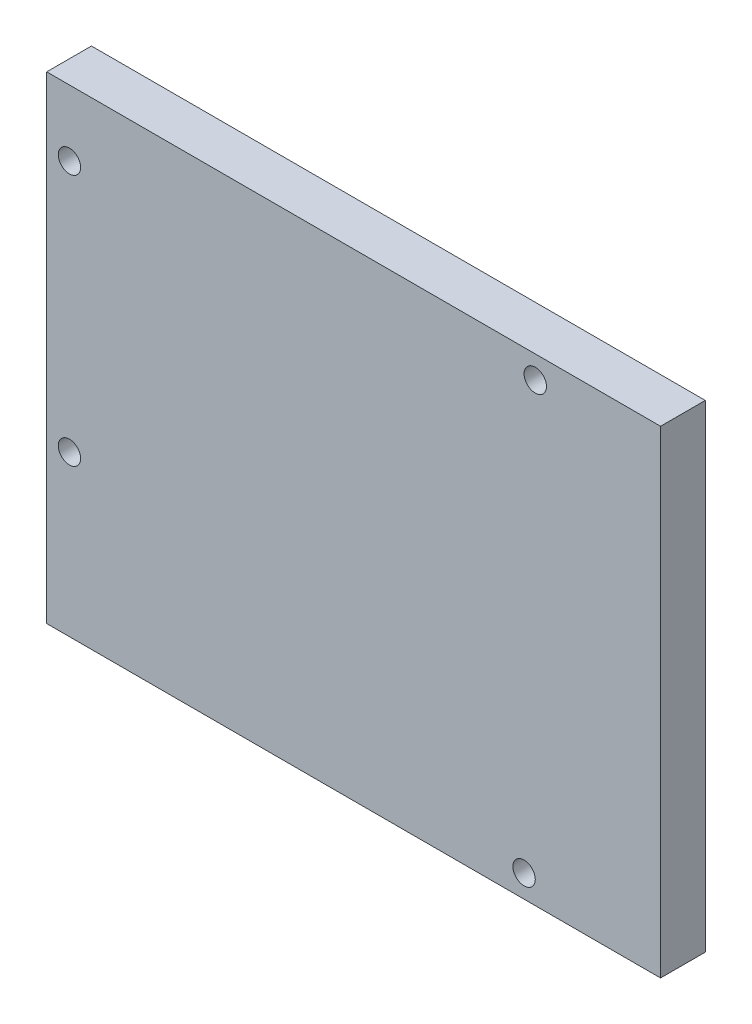
ISO-10303-21;
HEADER;
FILE_DESCRIPTION(('STEP AP214'),'2;1');
FILE_NAME('part.step','',(''),(''),'','','');
FILE_SCHEMA(('AUTOMOTIVE_DESIGN { 1 0 10303 214 1 1 1 1 }'));
ENDSEC;
DATA;
#1=APPLICATION_CONTEXT('core data for automotive mechanical design processes');
#2=APPLICATION_PROTOCOL_DEFINITION('international standard','automotive_design',2000,#1);
#3=PRODUCT_CONTEXT('',#1,'mechanical');
#4=PRODUCT('Part','Part','',(#3));
#5=PRODUCT_RELATED_PRODUCT_CATEGORY('part','',(#4));
#6=PRODUCT_DEFINITION_FORMATION('','',#4);
#7=PRODUCT_DEFINITION_CONTEXT('part definition',#1,'design');
#8=PRODUCT_DEFINITION('design','',#6,#7);
#9=PRODUCT_DEFINITION_SHAPE('','',#8);
#10=(LENGTH_UNIT() NAMED_UNIT(*) SI_UNIT(.MILLI.,.METRE.));
#11=(NAMED_UNIT(*) PLANE_ANGLE_UNIT() SI_UNIT($,.RADIAN.));
#12=(NAMED_UNIT(*) SI_UNIT($,.STERADIAN.) SOLID_ANGLE_UNIT());
#13=UNCERTAINTY_MEASURE_WITH_UNIT(LENGTH_MEASURE(1.E-05),#10,'distance_accuracy_value','');
#14=(GEOMETRIC_REPRESENTATION_CONTEXT(3) GLOBAL_UNCERTAINTY_ASSIGNED_CONTEXT((#13)) GLOBAL_UNIT_ASSIGNED_CONTEXT((#10,
#11,#12)) REPRESENTATION_CONTEXT('',''));
#15=CARTESIAN_POINT('',(0.,0.,0.));
#16=DIRECTION('',(0.,0.,1.));
#17=DIRECTION('',(1.,0.,0.));
#18=AXIS2_PLACEMENT_3D('',#15,#16,#17);
#19=CARTESIAN_POINT('',(0.,37.8100000011118,5.));
#20=DIRECTION('',(1.,0.,0.));
#21=DIRECTION('',(0.,1.,0.));
#22=AXIS2_PLACEMENT_3D('',#19,#20,#21);
#23=PLANE('',#22);
#24=DIRECTION('',(0.,-1.,0.));
#25=VECTOR('',#24,1.);
#26=CARTESIAN_POINT('',(0.,37.8100000011118,0.));
#27=LINE('',#26,#25);
#28=CARTESIAN_POINT('',(0.,37.8100000011118,0.));
#29=VERTEX_POINT('',#28);
#30=CARTESIAN_POINT('',(0.,-15.5899999988882,0.));
#31=VERTEX_POINT('',#30);
#32=EDGE_CURVE('E110',#29,#31,#27,.T.);
#33=ORIENTED_EDGE('',*,*,#32,.T.);
#34=DIRECTION('',(0.,0.,-1.));
#35=VECTOR('',#34,1.);
#36=CARTESIAN_POINT('',(0.,-15.5899999988882,5.));
#37=LINE('',#36,#35);
#38=CARTESIAN_POINT('',(0.,-15.5899999988882,5.));
#39=VERTEX_POINT('',#38);
#40=EDGE_CURVE('E11',#39,#31,#37,.T.);
#41=ORIENTED_EDGE('',*,*,#40,.F.);
#42=DIRECTION('',(0.,-1.,0.));
#43=VECTOR('',#42,1.);
#44=CARTESIAN_POINT('',(0.,37.8100000011118,5.));
#45=LINE('',#44,#43);
#46=CARTESIAN_POINT('',(0.,37.8100000011118,5.));
#47=VERTEX_POINT('',#46);
#48=EDGE_CURVE('E93',#47,#39,#45,.T.);
#49=ORIENTED_EDGE('',*,*,#48,.F.);
#50=DIRECTION('',(0.,0.,-1.));
#51=VECTOR('',#50,1.);
#52=CARTESIAN_POINT('',(0.,37.8100000011118,5.));
#53=LINE('',#52,#51);
#54=EDGE_CURVE('E106',#47,#29,#53,.T.);
#55=ORIENTED_EDGE('',*,*,#54,.T.);
#56=EDGE_LOOP('',(#33,#41,#49,#55));
#57=FACE_BOUND('',#56,.T.);
#58=ADVANCED_FACE('F39',(#57),#23,.F.);
#59=CARTESIAN_POINT('',(0.,-15.5899999988882,5.));
#60=DIRECTION('',(0.,1.,0.));
#61=DIRECTION('',(0.,0.,1.));
#62=AXIS2_PLACEMENT_3D('',#59,#60,#61);
#63=PLANE('',#62);
#64=DIRECTION('',(1.,0.,0.));
#65=VECTOR('',#64,1.);
#66=CARTESIAN_POINT('',(0.,-15.5899999988882,0.));
#67=LINE('',#66,#65);
#68=CARTESIAN_POINT('',(68.6000000011118,-15.5899999988882,0.));
#69=VERTEX_POINT('',#68);
#70=EDGE_CURVE('E98',#31,#69,#67,.T.);
#71=ORIENTED_EDGE('',*,*,#70,.T.);
#72=DIRECTION('',(0.,0.,-1.));
#73=VECTOR('',#72,1.);
#74=CARTESIAN_POINT('',(68.6000000011118,-15.5899999988882,5.));
#75=LINE('',#74,#73);
#76=CARTESIAN_POINT('',(68.6000000011118,-15.5899999988882,5.));
#77=VERTEX_POINT('',#76);
#78=EDGE_CURVE('E49',#77,#69,#75,.T.);
#79=ORIENTED_EDGE('',*,*,#78,.F.);
#80=DIRECTION('',(1.,0.,0.));
#81=VECTOR('',#80,1.);
#82=CARTESIAN_POINT('',(0.,-15.5899999988882,5.));
#83=LINE('',#82,#81);
#84=EDGE_CURVE('E88',#39,#77,#83,.T.);
#85=ORIENTED_EDGE('',*,*,#84,.F.);
#86=ORIENTED_EDGE('',*,*,#40,.T.);
#87=EDGE_LOOP('',(#71,#79,#85,#86));
#88=FACE_BOUND('',#87,.T.);
#89=ADVANCED_FACE('F97',(#88),#63,.F.);
#90=CARTESIAN_POINT('',(68.6000000011118,37.8100000011118,5.));
#91=DIRECTION('',(-1.,0.,0.));
#92=DIRECTION('',(0.,0.,1.));
#93=AXIS2_PLACEMENT_3D('',#90,#91,#92);
#94=PLANE('',#93);
#95=DIRECTION('',(0.,1.,0.));
#96=VECTOR('',#95,1.);
#97=CARTESIAN_POINT('',(68.6000000011118,37.8100000011118,0.));
#98=LINE('',#97,#96);
#99=CARTESIAN_POINT('',(68.6000000011118,37.8100000011118,0.));
#100=VERTEX_POINT('',#99);
#101=EDGE_CURVE('E75',#69,#100,#98,.T.);
#102=ORIENTED_EDGE('',*,*,#101,.T.);
#103=DIRECTION('',(0.,0.,-1.));
#104=VECTOR('',#103,1.);
#105=CARTESIAN_POINT('',(68.6000000011118,37.8100000011118,5.));
#106=LINE('',#105,#104);
#107=CARTESIAN_POINT('',(68.6000000011118,37.8100000011118,5.));
#108=VERTEX_POINT('',#107);
#109=EDGE_CURVE('E100',#108,#100,#106,.T.);
#110=ORIENTED_EDGE('',*,*,#109,.F.);
#111=DIRECTION('',(0.,1.,0.));
#112=VECTOR('',#111,1.);
#113=CARTESIAN_POINT('',(68.6000000011118,37.8100000011118,5.));
#114=LINE('',#113,#112);
#115=EDGE_CURVE('E91',#77,#108,#114,.T.);
#116=ORIENTED_EDGE('',*,*,#115,.F.);
#117=ORIENTED_EDGE('',*,*,#78,.T.);
#118=EDGE_LOOP('',(#102,#110,#116,#117));
#119=FACE_BOUND('',#118,.T.);
#120=ADVANCED_FACE('F102',(#119),#94,.F.);
#121=CARTESIAN_POINT('',(0.,37.8100000011118,5.));
#122=DIRECTION('',(0.,-1.,0.));
#123=DIRECTION('',(0.,0.,-1.));
#124=AXIS2_PLACEMENT_3D('',#121,#122,#123);
#125=PLANE('',#124);
#126=DIRECTION('',(-1.,0.,0.));
#127=VECTOR('',#126,1.);
#128=CARTESIAN_POINT('',(0.,37.8100000011118,0.));
#129=LINE('',#128,#127);
#130=EDGE_CURVE('E81',#100,#29,#129,.T.);
#131=ORIENTED_EDGE('',*,*,#130,.T.);
#132=ORIENTED_EDGE('',*,*,#54,.F.);
#133=DIRECTION('',(-1.,0.,0.));
#134=VECTOR('',#133,1.);
#135=CARTESIAN_POINT('',(0.,37.8100000011118,5.));
#136=LINE('',#135,#134);
#137=EDGE_CURVE('E58',#108,#47,#136,.T.);
#138=ORIENTED_EDGE('',*,*,#137,.F.);
#139=ORIENTED_EDGE('',*,*,#109,.T.);
#140=EDGE_LOOP('',(#131,#132,#138,#139));
#141=FACE_BOUND('',#140,.T.);
#142=ADVANCED_FACE('F171',(#141),#125,.F.);
#143=CARTESIAN_POINT('',(0.,0.,5.));
#144=DIRECTION('',(0.,0.,1.));
#145=DIRECTION('',(1.,0.,0.));
#146=AXIS2_PLACEMENT_3D('',#143,#144,#145);
#147=PLANE('',#146);
#148=CARTESIAN_POINT('',(53.3500000011118,-13.0499999988882,5.));
#149=DIRECTION('',(0.,0.,1.));
#150=DIRECTION('',(1.,0.,0.));
#151=AXIS2_PLACEMENT_3D('',#148,#149,#150);
#152=CIRCLE('',#151,1.25);
#153=CARTESIAN_POINT('',(54.6000000011118,-13.0499999988882,5.));
#154=VERTEX_POINT('',#153);
#155=EDGE_CURVE('E241',#154,#154,#152,.T.);
#156=ORIENTED_EDGE('',*,*,#155,.F.);
#157=EDGE_LOOP('',(#156));
#158=FACE_BOUND('',#157,.T.);
#159=CARTESIAN_POINT('',(54.6000000011118,35.2700000011118,5.));
#160=DIRECTION('',(0.,0.,1.));
#161=DIRECTION('',(1.,0.,0.));
#162=AXIS2_PLACEMENT_3D('',#159,#160,#161);
#163=CIRCLE('',#162,1.25);
#164=CARTESIAN_POINT('',(55.8500000011118,35.2700000011118,5.));
#165=VERTEX_POINT('',#164);
#166=EDGE_CURVE('E234',#165,#165,#163,.T.);
#167=ORIENTED_EDGE('',*,*,#166,.F.);
#168=EDGE_LOOP('',(#167));
#169=FACE_BOUND('',#168,.T.);
#170=CARTESIAN_POINT('',(2.54,30.4500000011118,5.));
#171=DIRECTION('',(0.,0.,1.));
#172=DIRECTION('',(1.,0.,0.));
#173=AXIS2_PLACEMENT_3D('',#170,#171,#172);
#174=CIRCLE('',#173,1.25);
#175=CARTESIAN_POINT('',(3.79,30.4500000011118,5.));
#176=VERTEX_POINT('',#175);
#177=EDGE_CURVE('E226',#176,#176,#174,.T.);
#178=ORIENTED_EDGE('',*,*,#177,.F.);
#179=EDGE_LOOP('',(#178));
#180=FACE_BOUND('',#179,.T.);
#181=CARTESIAN_POINT('',(2.54,2.28000000111181,5.));
#182=DIRECTION('',(0.,0.,1.));
#183=DIRECTION('',(1.,0.,0.));
#184=AXIS2_PLACEMENT_3D('',#181,#182,#183);
#185=CIRCLE('',#184,1.25);
#186=CARTESIAN_POINT('',(3.79,2.28000000111181,5.));
#187=VERTEX_POINT('',#186);
#188=EDGE_CURVE('E129',#187,#187,#185,.T.);
#189=ORIENTED_EDGE('',*,*,#188,.F.);
#190=EDGE_LOOP('',(#189));
#191=FACE_BOUND('',#190,.T.);
#192=ORIENTED_EDGE('',*,*,#48,.T.);
#193=ORIENTED_EDGE('',*,*,#84,.T.);
#194=ORIENTED_EDGE('',*,*,#115,.T.);
#195=ORIENTED_EDGE('',*,*,#137,.T.);
#196=EDGE_LOOP('',(#192,#193,#194,#195));
#197=FACE_BOUND('',#196,.T.);
#198=ADVANCED_FACE('F89',(#158,#169,#180,#191,#197),#147,.T.);
#199=CARTESIAN_POINT('',(0.,0.,0.));
#200=DIRECTION('',(0.,0.,1.));
#201=DIRECTION('',(1.,0.,0.));
#202=AXIS2_PLACEMENT_3D('',#199,#200,#201);
#203=PLANE('',#202);
#204=CARTESIAN_POINT('',(53.3500000011118,-13.0499999988882,0.));
#205=DIRECTION('',(0.,0.,1.));
#206=DIRECTION('',(1.,0.,0.));
#207=AXIS2_PLACEMENT_3D('',#204,#205,#206);
#208=CIRCLE('',#207,1.25);
#209=CARTESIAN_POINT('',(54.6000000011118,-13.0499999988882,0.));
#210=VERTEX_POINT('',#209);
#211=EDGE_CURVE('E42',#210,#210,#208,.T.);
#212=ORIENTED_EDGE('',*,*,#211,.T.);
#213=EDGE_LOOP('',(#212));
#214=FACE_BOUND('',#213,.T.);
#215=CARTESIAN_POINT('',(54.6000000011118,35.2700000011118,0.));
#216=DIRECTION('',(0.,0.,1.));
#217=DIRECTION('',(1.,0.,0.));
#218=AXIS2_PLACEMENT_3D('',#215,#216,#217);
#219=CIRCLE('',#218,1.25);
#220=CARTESIAN_POINT('',(55.8500000011118,35.2700000011118,0.));
#221=VERTEX_POINT('',#220);
#222=EDGE_CURVE('E132',#221,#221,#219,.T.);
#223=ORIENTED_EDGE('',*,*,#222,.T.);
#224=EDGE_LOOP('',(#223));
#225=FACE_BOUND('',#224,.T.);
#226=CARTESIAN_POINT('',(2.54,30.4500000011118,0.));
#227=DIRECTION('',(0.,0.,1.));
#228=DIRECTION('',(1.,0.,0.));
#229=AXIS2_PLACEMENT_3D('',#226,#227,#228);
#230=CIRCLE('',#229,1.25);
#231=CARTESIAN_POINT('',(3.79,30.4500000011118,0.));
#232=VERTEX_POINT('',#231);
#233=EDGE_CURVE('E128',#232,#232,#230,.T.);
#234=ORIENTED_EDGE('',*,*,#233,.T.);
#235=EDGE_LOOP('',(#234));
#236=FACE_BOUND('',#235,.T.);
#237=CARTESIAN_POINT('',(2.54,2.28000000111181,0.));
#238=DIRECTION('',(0.,0.,1.));
#239=DIRECTION('',(1.,0.,0.));
#240=AXIS2_PLACEMENT_3D('',#237,#238,#239);
#241=CIRCLE('',#240,1.25);
#242=CARTESIAN_POINT('',(3.79,2.28000000111181,0.));
#243=VERTEX_POINT('',#242);
#244=EDGE_CURVE('E124',#243,#243,#241,.T.);
#245=ORIENTED_EDGE('',*,*,#244,.T.);
#246=EDGE_LOOP('',(#245));
#247=FACE_BOUND('',#246,.T.);
#248=ORIENTED_EDGE('',*,*,#32,.F.);
#249=ORIENTED_EDGE('',*,*,#130,.F.);
#250=ORIENTED_EDGE('',*,*,#101,.F.);
#251=ORIENTED_EDGE('',*,*,#70,.F.);
#252=EDGE_LOOP('',(#248,#249,#250,#251));
#253=FACE_BOUND('',#252,.T.);
#254=ADVANCED_FACE('F141',(#214,#225,#236,#247,#253),#203,.F.);
#255=CARTESIAN_POINT('',(2.54,2.28000000111181,-1.2E-05));
#256=DIRECTION('',(0.,0.,1.));
#257=DIRECTION('',(1.,0.,0.));
#258=AXIS2_PLACEMENT_3D('',#255,#256,#257);
#259=CYLINDRICAL_SURFACE('',#258,1.25);
#260=CARTESIAN_POINT('',(3.79,2.28000000111181,5.));
#261=CARTESIAN_POINT('',(3.79,2.28000000111181,4.94791666666667));
#262=CARTESIAN_POINT('',(3.79,2.28000000111181,4.89583333333333));
#263=CARTESIAN_POINT('',(3.79,2.28000000111181,4.79166666666667));
#264=CARTESIAN_POINT('',(3.79,2.28000000111181,4.73958333333333));
#265=CARTESIAN_POINT('',(3.79,2.28000000111181,4.63541666666667));
#266=CARTESIAN_POINT('',(3.79,2.28000000111181,4.58333333333333));
#267=CARTESIAN_POINT('',(3.79,2.28000000111181,4.47916666666667));
#268=CARTESIAN_POINT('',(3.79,2.28000000111181,4.42708333333333));
#269=CARTESIAN_POINT('',(3.79,2.28000000111181,4.32291666666667));
#270=CARTESIAN_POINT('',(3.79,2.28000000111181,4.27083333333333));
#271=CARTESIAN_POINT('',(3.79,2.28000000111181,4.16666666666667));
#272=CARTESIAN_POINT('',(3.79,2.28000000111181,4.11458333333333));
#273=CARTESIAN_POINT('',(3.79,2.28000000111181,4.01041666666667));
#274=CARTESIAN_POINT('',(3.79,2.28000000111181,3.95833333333333));
#275=CARTESIAN_POINT('',(3.79,2.28000000111181,3.85416666666667));
#276=CARTESIAN_POINT('',(3.79,2.28000000111181,3.80208333333333));
#277=CARTESIAN_POINT('',(3.79,2.28000000111181,3.69791666666667));
#278=CARTESIAN_POINT('',(3.79,2.28000000111181,3.64583333333333));
#279=CARTESIAN_POINT('',(3.79,2.28000000111181,3.54166666666667));
#280=CARTESIAN_POINT('',(3.79,2.28000000111181,3.48958333333333));
#281=CARTESIAN_POINT('',(3.79,2.28000000111181,3.38541666666667));
#282=CARTESIAN_POINT('',(3.79,2.28000000111181,3.33333333333333));
#283=CARTESIAN_POINT('',(3.79,2.28000000111181,3.22916666666667));
#284=CARTESIAN_POINT('',(3.79,2.28000000111181,3.17708333333333));
#285=CARTESIAN_POINT('',(3.79,2.28000000111181,3.07291666666667));
#286=CARTESIAN_POINT('',(3.79,2.28000000111181,3.02083333333333));
#287=CARTESIAN_POINT('',(3.79,2.28000000111181,2.91666666666667));
#288=CARTESIAN_POINT('',(3.79,2.28000000111181,2.86458333333333));
#289=CARTESIAN_POINT('',(3.79,2.28000000111181,2.76041666666667));
#290=CARTESIAN_POINT('',(3.79,2.28000000111181,2.70833333333333));
#291=CARTESIAN_POINT('',(3.79,2.28000000111181,2.60416666666667));
#292=CARTESIAN_POINT('',(3.79,2.28000000111181,2.55208333333333));
#293=CARTESIAN_POINT('',(3.79,2.28000000111181,2.44791666666667));
#294=CARTESIAN_POINT('',(3.79,2.28000000111181,2.39583333333333));
#295=CARTESIAN_POINT('',(3.79,2.28000000111181,2.29166666666667));
#296=CARTESIAN_POINT('',(3.79,2.28000000111181,2.23958333333333));
#297=CARTESIAN_POINT('',(3.79,2.28000000111181,2.13541666666667));
#298=CARTESIAN_POINT('',(3.79,2.28000000111181,2.08333333333333));
#299=CARTESIAN_POINT('',(3.79,2.28000000111181,1.97916666666667));
#300=CARTESIAN_POINT('',(3.79,2.28000000111181,1.92708333333333));
#301=CARTESIAN_POINT('',(3.79,2.28000000111181,1.82291666666667));
#302=CARTESIAN_POINT('',(3.79,2.28000000111181,1.77083333333333));
#303=CARTESIAN_POINT('',(3.79,2.28000000111181,1.66666666666667));
#304=CARTESIAN_POINT('',(3.79,2.28000000111181,1.61458333333333));
#305=CARTESIAN_POINT('',(3.79,2.28000000111181,1.51041666666667));
#306=CARTESIAN_POINT('',(3.79,2.28000000111181,1.45833333333333));
#307=CARTESIAN_POINT('',(3.79,2.28000000111181,1.35416666666667));
#308=CARTESIAN_POINT('',(3.79,2.28000000111181,1.30208333333333));
#309=CARTESIAN_POINT('',(3.79,2.28000000111181,1.19791666666667));
#310=CARTESIAN_POINT('',(3.79,2.28000000111181,1.14583333333333));
#311=CARTESIAN_POINT('',(3.79,2.28000000111181,1.04166666666667));
#312=CARTESIAN_POINT('',(3.79,2.28000000111181,0.989583333333333));
#313=CARTESIAN_POINT('',(3.79,2.28000000111181,0.885416666666666));
#314=CARTESIAN_POINT('',(3.79,2.28000000111181,0.833333333333333));
#315=CARTESIAN_POINT('',(3.79,2.28000000111181,0.729166666666666));
#316=CARTESIAN_POINT('',(3.79,2.28000000111181,0.677083333333333));
#317=CARTESIAN_POINT('',(3.79,2.28000000111181,0.572916666666666));
#318=CARTESIAN_POINT('',(3.79,2.28000000111181,0.520833333333333));
#319=CARTESIAN_POINT('',(3.79,2.28000000111181,0.416666666666667));
#320=CARTESIAN_POINT('',(3.79,2.28000000111181,0.364583333333333));
#321=CARTESIAN_POINT('',(3.79,2.28000000111181,0.260416666666667));
#322=CARTESIAN_POINT('',(3.79,2.28000000111181,0.208333333333333));
#323=CARTESIAN_POINT('',(3.79,2.28000000111181,0.104166666666666));
#324=CARTESIAN_POINT('',(3.79,2.28000000111181,0.0520833333333331));
#325=CARTESIAN_POINT('',(3.79,2.28000000111181,0.));
#326=B_SPLINE_CURVE_WITH_KNOTS('',3,(#260,#261,#262,#263,#264,#265,#266,#267,#268,#269,#270,
#271,#272,#273,#274,#275,#276,#277,#278,#279,#280,#281,#282,#283,#284,#285,#286,#287,#288,#289,
#290,#291,#292,#293,#294,#295,#296,#297,#298,#299,#300,#301,#302,#303,#304,#305,#306,#307,#308,
#309,#310,#311,#312,#313,#314,#315,#316,#317,#318,#319,#320,#321,#322,#323,#324,#325),
.UNSPECIFIED.,.F.,.F.,(4,2,2,2,2,2,2,2,2,2,2,2,2,2,2,2,2,2,2,2,2,2,2,2,2,2,2,2,2,2,2,2,4),(0.,
0.15625,0.3125,0.46875,0.625,0.78125,0.9375,1.09375,1.25,1.40625,1.5625,1.71875,1.875,2.03125,
2.1875,2.34375,2.5,2.65625,2.8125,2.96875,3.125,3.28125,3.4375,3.59375,3.75,3.90625,4.0625,
4.21875,4.375,4.53125,4.6875,4.84375,5.),.UNSPECIFIED.);
#327=EDGE_CURVE('BSEAM164',#187,#243,#326,.T.);
#328=ORIENTED_EDGE('',*,*,#188,.T.);
#329=ORIENTED_EDGE('',*,*,#244,.F.);
#330=ORIENTED_EDGE('',*,*,#327,.T.);
#331=ORIENTED_EDGE('',*,*,#327,.F.);
#332=EDGE_LOOP('',(#328,#330,#329,#331));
#333=FACE_BOUND('',#332,.T.);
#334=ADVANCED_FACE('F164',(#333),#259,.F.);
#335=CARTESIAN_POINT('',(2.54,30.4500000011118,-1.2E-05));
#336=DIRECTION('',(0.,0.,1.));
#337=DIRECTION('',(1.,0.,0.));
#338=AXIS2_PLACEMENT_3D('',#335,#336,#337);
#339=CYLINDRICAL_SURFACE('',#338,1.25);
#340=CARTESIAN_POINT('',(3.79,30.4500000011118,5.));
#341=CARTESIAN_POINT('',(3.79,30.4500000011118,4.94791666666667));
#342=CARTESIAN_POINT('',(3.79,30.4500000011118,4.89583333333333));
#343=CARTESIAN_POINT('',(3.79,30.4500000011118,4.79166666666667));
#344=CARTESIAN_POINT('',(3.79,30.4500000011118,4.73958333333333));
#345=CARTESIAN_POINT('',(3.79,30.4500000011118,4.63541666666667));
#346=CARTESIAN_POINT('',(3.79,30.4500000011118,4.58333333333333));
#347=CARTESIAN_POINT('',(3.79,30.4500000011118,4.47916666666667));
#348=CARTESIAN_POINT('',(3.79,30.4500000011118,4.42708333333333));
#349=CARTESIAN_POINT('',(3.79,30.4500000011118,4.32291666666667));
#350=CARTESIAN_POINT('',(3.79,30.4500000011118,4.27083333333333));
#351=CARTESIAN_POINT('',(3.79,30.4500000011118,4.16666666666667));
#352=CARTESIAN_POINT('',(3.79,30.4500000011118,4.11458333333333));
#353=CARTESIAN_POINT('',(3.79,30.4500000011118,4.01041666666667));
#354=CARTESIAN_POINT('',(3.79,30.4500000011118,3.95833333333333));
#355=CARTESIAN_POINT('',(3.79,30.4500000011118,3.85416666666667));
#356=CARTESIAN_POINT('',(3.79,30.4500000011118,3.80208333333333));
#357=CARTESIAN_POINT('',(3.79,30.4500000011118,3.69791666666667));
#358=CARTESIAN_POINT('',(3.79,30.4500000011118,3.64583333333333));
#359=CARTESIAN_POINT('',(3.79,30.4500000011118,3.54166666666667));
#360=CARTESIAN_POINT('',(3.79,30.4500000011118,3.48958333333333));
#361=CARTESIAN_POINT('',(3.79,30.4500000011118,3.38541666666667));
#362=CARTESIAN_POINT('',(3.79,30.4500000011118,3.33333333333333));
#363=CARTESIAN_POINT('',(3.79,30.4500000011118,3.22916666666667));
#364=CARTESIAN_POINT('',(3.79,30.4500000011118,3.17708333333333));
#365=CARTESIAN_POINT('',(3.79,30.4500000011118,3.07291666666667));
#366=CARTESIAN_POINT('',(3.79,30.4500000011118,3.02083333333333));
#367=CARTESIAN_POINT('',(3.79,30.4500000011118,2.91666666666667));
#368=CARTESIAN_POINT('',(3.79,30.4500000011118,2.86458333333333));
#369=CARTESIAN_POINT('',(3.79,30.4500000011118,2.76041666666667));
#370=CARTESIAN_POINT('',(3.79,30.4500000011118,2.70833333333333));
#371=CARTESIAN_POINT('',(3.79,30.4500000011118,2.60416666666667));
#372=CARTESIAN_POINT('',(3.79,30.4500000011118,2.55208333333333));
#373=CARTESIAN_POINT('',(3.79,30.4500000011118,2.44791666666667));
#374=CARTESIAN_POINT('',(3.79,30.4500000011118,2.39583333333333));
#375=CARTESIAN_POINT('',(3.79,30.4500000011118,2.29166666666667));
#376=CARTESIAN_POINT('',(3.79,30.4500000011118,2.23958333333333));
#377=CARTESIAN_POINT('',(3.79,30.4500000011118,2.13541666666667));
#378=CARTESIAN_POINT('',(3.79,30.4500000011118,2.08333333333333));
#379=CARTESIAN_POINT('',(3.79,30.4500000011118,1.97916666666667));
#380=CARTESIAN_POINT('',(3.79,30.4500000011118,1.92708333333333));
#381=CARTESIAN_POINT('',(3.79,30.4500000011118,1.82291666666667));
#382=CARTESIAN_POINT('',(3.79,30.4500000011118,1.77083333333333));
#383=CARTESIAN_POINT('',(3.79,30.4500000011118,1.66666666666667));
#384=CARTESIAN_POINT('',(3.79,30.4500000011118,1.61458333333333));
#385=CARTESIAN_POINT('',(3.79,30.4500000011118,1.51041666666667));
#386=CARTESIAN_POINT('',(3.79,30.4500000011118,1.45833333333333));
#387=CARTESIAN_POINT('',(3.79,30.4500000011118,1.35416666666667));
#388=CARTESIAN_POINT('',(3.79,30.4500000011118,1.30208333333333));
#389=CARTESIAN_POINT('',(3.79,30.4500000011118,1.19791666666667));
#390=CARTESIAN_POINT('',(3.79,30.4500000011118,1.14583333333333));
#391=CARTESIAN_POINT('',(3.79,30.4500000011118,1.04166666666667));
#392=CARTESIAN_POINT('',(3.79,30.4500000011118,0.989583333333333));
#393=CARTESIAN_POINT('',(3.79,30.4500000011118,0.885416666666666));
#394=CARTESIAN_POINT('',(3.79,30.4500000011118,0.833333333333333));
#395=CARTESIAN_POINT('',(3.79,30.4500000011118,0.729166666666666));
#396=CARTESIAN_POINT('',(3.79,30.4500000011118,0.677083333333333));
#397=CARTESIAN_POINT('',(3.79,30.4500000011118,0.572916666666666));
#398=CARTESIAN_POINT('',(3.79,30.4500000011118,0.520833333333333));
#399=CARTESIAN_POINT('',(3.79,30.4500000011118,0.416666666666667));
#400=CARTESIAN_POINT('',(3.79,30.4500000011118,0.364583333333333));
#401=CARTESIAN_POINT('',(3.79,30.4500000011118,0.260416666666667));
#402=CARTESIAN_POINT('',(3.79,30.4500000011118,0.208333333333333));
#403=CARTESIAN_POINT('',(3.79,30.4500000011118,0.104166666666666));
#404=CARTESIAN_POINT('',(3.79,30.4500000011118,0.0520833333333331));
#405=CARTESIAN_POINT('',(3.79,30.4500000011118,0.));
#406=B_SPLINE_CURVE_WITH_KNOTS('',3,(#340,#341,#342,#343,#344,#345,#346,#347,#348,#349,#350,
#351,#352,#353,#354,#355,#356,#357,#358,#359,#360,#361,#362,#363,#364,#365,#366,#367,#368,#369,
#370,#371,#372,#373,#374,#375,#376,#377,#378,#379,#380,#381,#382,#383,#384,#385,#386,#387,#388,
#389,#390,#391,#392,#393,#394,#395,#396,#397,#398,#399,#400,#401,#402,#403,#404,#405),
.UNSPECIFIED.,.F.,.F.,(4,2,2,2,2,2,2,2,2,2,2,2,2,2,2,2,2,2,2,2,2,2,2,2,2,2,2,2,2,2,2,2,4),(0.,
0.15625,0.3125,0.46875,0.625,0.78125,0.9375,1.09375,1.25,1.40625,1.5625,1.71875,1.875,2.03125,
2.1875,2.34375,2.5,2.65625,2.8125,2.96875,3.125,3.28125,3.4375,3.59375,3.75,3.90625,4.0625,
4.21875,4.375,4.53125,4.6875,4.84375,5.),.UNSPECIFIED.);
#407=EDGE_CURVE('BSEAM151',#176,#232,#406,.T.);
#408=ORIENTED_EDGE('',*,*,#177,.T.);
#409=ORIENTED_EDGE('',*,*,#233,.F.);
#410=ORIENTED_EDGE('',*,*,#407,.T.);
#411=ORIENTED_EDGE('',*,*,#407,.F.);
#412=EDGE_LOOP('',(#408,#410,#409,#411));
#413=FACE_BOUND('',#412,.T.);
#414=ADVANCED_FACE('F151',(#413),#339,.F.);
#415=CARTESIAN_POINT('',(54.6000000011118,35.2700000011118,-1.2E-05));
#416=DIRECTION('',(0.,0.,1.));
#417=DIRECTION('',(1.,0.,0.));
#418=AXIS2_PLACEMENT_3D('',#415,#416,#417);
#419=CYLINDRICAL_SURFACE('',#418,1.25);
#420=CARTESIAN_POINT('',(55.8500000011118,35.2700000011118,5.));
#421=CARTESIAN_POINT('',(55.8500000011118,35.2700000011118,4.94791666666667));
#422=CARTESIAN_POINT('',(55.8500000011118,35.2700000011118,4.89583333333333));
#423=CARTESIAN_POINT('',(55.8500000011118,35.2700000011118,4.79166666666667));
#424=CARTESIAN_POINT('',(55.8500000011118,35.2700000011118,4.73958333333333));
#425=CARTESIAN_POINT('',(55.8500000011118,35.2700000011118,4.63541666666667));
#426=CARTESIAN_POINT('',(55.8500000011118,35.2700000011118,4.58333333333333));
#427=CARTESIAN_POINT('',(55.8500000011118,35.2700000011118,4.47916666666667));
#428=CARTESIAN_POINT('',(55.8500000011118,35.2700000011118,4.42708333333333));
#429=CARTESIAN_POINT('',(55.8500000011118,35.2700000011118,4.32291666666667));
#430=CARTESIAN_POINT('',(55.8500000011118,35.2700000011118,4.27083333333333));
#431=CARTESIAN_POINT('',(55.8500000011118,35.2700000011118,4.16666666666667));
#432=CARTESIAN_POINT('',(55.8500000011118,35.2700000011118,4.11458333333333));
#433=CARTESIAN_POINT('',(55.8500000011118,35.2700000011118,4.01041666666667));
#434=CARTESIAN_POINT('',(55.8500000011118,35.2700000011118,3.95833333333333));
#435=CARTESIAN_POINT('',(55.8500000011118,35.2700000011118,3.85416666666667));
#436=CARTESIAN_POINT('',(55.8500000011118,35.2700000011118,3.80208333333333));
#437=CARTESIAN_POINT('',(55.8500000011118,35.2700000011118,3.69791666666667));
#438=CARTESIAN_POINT('',(55.8500000011118,35.2700000011118,3.64583333333333));
#439=CARTESIAN_POINT('',(55.8500000011118,35.2700000011118,3.54166666666667));
#440=CARTESIAN_POINT('',(55.8500000011118,35.2700000011118,3.48958333333333));
#441=CARTESIAN_POINT('',(55.8500000011118,35.2700000011118,3.38541666666667));
#442=CARTESIAN_POINT('',(55.8500000011118,35.2700000011118,3.33333333333333));
#443=CARTESIAN_POINT('',(55.8500000011118,35.2700000011118,3.22916666666667));
#444=CARTESIAN_POINT('',(55.8500000011118,35.2700000011118,3.17708333333333));
#445=CARTESIAN_POINT('',(55.8500000011118,35.2700000011118,3.07291666666667));
#446=CARTESIAN_POINT('',(55.8500000011118,35.2700000011118,3.02083333333333));
#447=CARTESIAN_POINT('',(55.8500000011118,35.2700000011118,2.91666666666667));
#448=CARTESIAN_POINT('',(55.8500000011118,35.2700000011118,2.86458333333333));
#449=CARTESIAN_POINT('',(55.8500000011118,35.2700000011118,2.76041666666667));
#450=CARTESIAN_POINT('',(55.8500000011118,35.2700000011118,2.70833333333333));
#451=CARTESIAN_POINT('',(55.8500000011118,35.2700000011118,2.60416666666667));
#452=CARTESIAN_POINT('',(55.8500000011118,35.2700000011118,2.55208333333333));
#453=CARTESIAN_POINT('',(55.8500000011118,35.2700000011118,2.44791666666667));
#454=CARTESIAN_POINT('',(55.8500000011118,35.2700000011118,2.39583333333333));
#455=CARTESIAN_POINT('',(55.8500000011118,35.2700000011118,2.29166666666667));
#456=CARTESIAN_POINT('',(55.8500000011118,35.2700000011118,2.23958333333333));
#457=CARTESIAN_POINT('',(55.8500000011118,35.2700000011118,2.13541666666667));
#458=CARTESIAN_POINT('',(55.8500000011118,35.2700000011118,2.08333333333333));
#459=CARTESIAN_POINT('',(55.8500000011118,35.2700000011118,1.97916666666667));
#460=CARTESIAN_POINT('',(55.8500000011118,35.2700000011118,1.92708333333333));
#461=CARTESIAN_POINT('',(55.8500000011118,35.2700000011118,1.82291666666667));
#462=CARTESIAN_POINT('',(55.8500000011118,35.2700000011118,1.77083333333333));
#463=CARTESIAN_POINT('',(55.8500000011118,35.2700000011118,1.66666666666667));
#464=CARTESIAN_POINT('',(55.8500000011118,35.2700000011118,1.61458333333333));
#465=CARTESIAN_POINT('',(55.8500000011118,35.2700000011118,1.51041666666667));
#466=CARTESIAN_POINT('',(55.8500000011118,35.2700000011118,1.45833333333333));
#467=CARTESIAN_POINT('',(55.8500000011118,35.2700000011118,1.35416666666667));
#468=CARTESIAN_POINT('',(55.8500000011118,35.2700000011118,1.30208333333333));
#469=CARTESIAN_POINT('',(55.8500000011118,35.2700000011118,1.19791666666667));
#470=CARTESIAN_POINT('',(55.8500000011118,35.2700000011118,1.14583333333333));
#471=CARTESIAN_POINT('',(55.8500000011118,35.2700000011118,1.04166666666667));
#472=CARTESIAN_POINT('',(55.8500000011118,35.2700000011118,0.989583333333333));
#473=CARTESIAN_POINT('',(55.8500000011118,35.2700000011118,0.885416666666666));
#474=CARTESIAN_POINT('',(55.8500000011118,35.2700000011118,0.833333333333333));
#475=CARTESIAN_POINT('',(55.8500000011118,35.2700000011118,0.729166666666666));
#476=CARTESIAN_POINT('',(55.8500000011118,35.2700000011118,0.677083333333333));
#477=CARTESIAN_POINT('',(55.8500000011118,35.2700000011118,0.572916666666666));
#478=CARTESIAN_POINT('',(55.8500000011118,35.2700000011118,0.520833333333333));
#479=CARTESIAN_POINT('',(55.8500000011118,35.2700000011118,0.416666666666667));
#480=CARTESIAN_POINT('',(55.8500000011118,35.2700000011118,0.364583333333333));
#481=CARTESIAN_POINT('',(55.8500000011118,35.2700000011118,0.260416666666667));
#482=CARTESIAN_POINT('',(55.8500000011118,35.2700000011118,0.208333333333333));
#483=CARTESIAN_POINT('',(55.8500000011118,35.2700000011118,0.104166666666666));
#484=CARTESIAN_POINT('',(55.8500000011118,35.2700000011118,0.0520833333333331));
#485=CARTESIAN_POINT('',(55.8500000011118,35.2700000011118,0.));
#486=B_SPLINE_CURVE_WITH_KNOTS('',3,(#420,#421,#422,#423,#424,#425,#426,#427,#428,#429,#430,
#431,#432,#433,#434,#435,#436,#437,#438,#439,#440,#441,#442,#443,#444,#445,#446,#447,#448,#449,
#450,#451,#452,#453,#454,#455,#456,#457,#458,#459,#460,#461,#462,#463,#464,#465,#466,#467,#468,
#469,#470,#471,#472,#473,#474,#475,#476,#477,#478,#479,#480,#481,#482,#483,#484,#485),
.UNSPECIFIED.,.F.,.F.,(4,2,2,2,2,2,2,2,2,2,2,2,2,2,2,2,2,2,2,2,2,2,2,2,2,2,2,2,2,2,2,2,4),(0.,
0.15625,0.3125,0.46875,0.625,0.78125,0.9375,1.09375,1.25,1.40625,1.5625,1.71875,1.875,2.03125,
2.1875,2.34375,2.5,2.65625,2.8125,2.96875,3.125,3.28125,3.4375,3.59375,3.75,3.90625,4.0625,
4.21875,4.375,4.53125,4.6875,4.84375,5.),.UNSPECIFIED.);
#487=EDGE_CURVE('BSEAM145',#165,#221,#486,.T.);
#488=ORIENTED_EDGE('',*,*,#166,.T.);
#489=ORIENTED_EDGE('',*,*,#222,.F.);
#490=ORIENTED_EDGE('',*,*,#487,.T.);
#491=ORIENTED_EDGE('',*,*,#487,.F.);
#492=EDGE_LOOP('',(#488,#490,#489,#491));
#493=FACE_BOUND('',#492,.T.);
#494=ADVANCED_FACE('F145',(#493),#419,.F.);
#495=CARTESIAN_POINT('',(53.3500000011118,-13.0499999988882,-1.2E-05));
#496=DIRECTION('',(0.,0.,1.));
#497=DIRECTION('',(1.,0.,0.));
#498=AXIS2_PLACEMENT_3D('',#495,#496,#497);
#499=CYLINDRICAL_SURFACE('',#498,1.25);
#500=CARTESIAN_POINT('',(54.6000000011118,-13.0499999988882,5.));
#501=CARTESIAN_POINT('',(54.6000000011118,-13.0499999988882,4.94791666666667));
#502=CARTESIAN_POINT('',(54.6000000011118,-13.0499999988882,4.89583333333333));
#503=CARTESIAN_POINT('',(54.6000000011118,-13.0499999988882,4.79166666666667));
#504=CARTESIAN_POINT('',(54.6000000011118,-13.0499999988882,4.73958333333333));
#505=CARTESIAN_POINT('',(54.6000000011118,-13.0499999988882,4.63541666666667));
#506=CARTESIAN_POINT('',(54.6000000011118,-13.0499999988882,4.58333333333333));
#507=CARTESIAN_POINT('',(54.6000000011118,-13.0499999988882,4.47916666666667));
#508=CARTESIAN_POINT('',(54.6000000011118,-13.0499999988882,4.42708333333333));
#509=CARTESIAN_POINT('',(54.6000000011118,-13.0499999988882,4.32291666666667));
#510=CARTESIAN_POINT('',(54.6000000011118,-13.0499999988882,4.27083333333333));
#511=CARTESIAN_POINT('',(54.6000000011118,-13.0499999988882,4.16666666666667));
#512=CARTESIAN_POINT('',(54.6000000011118,-13.0499999988882,4.11458333333333));
#513=CARTESIAN_POINT('',(54.6000000011118,-13.0499999988882,4.01041666666667));
#514=CARTESIAN_POINT('',(54.6000000011118,-13.0499999988882,3.95833333333333));
#515=CARTESIAN_POINT('',(54.6000000011118,-13.0499999988882,3.85416666666667));
#516=CARTESIAN_POINT('',(54.6000000011118,-13.0499999988882,3.80208333333333));
#517=CARTESIAN_POINT('',(54.6000000011118,-13.0499999988882,3.69791666666667));
#518=CARTESIAN_POINT('',(54.6000000011118,-13.0499999988882,3.64583333333333));
#519=CARTESIAN_POINT('',(54.6000000011118,-13.0499999988882,3.54166666666667));
#520=CARTESIAN_POINT('',(54.6000000011118,-13.0499999988882,3.48958333333333));
#521=CARTESIAN_POINT('',(54.6000000011118,-13.0499999988882,3.38541666666667));
#522=CARTESIAN_POINT('',(54.6000000011118,-13.0499999988882,3.33333333333333));
#523=CARTESIAN_POINT('',(54.6000000011118,-13.0499999988882,3.22916666666667));
#524=CARTESIAN_POINT('',(54.6000000011118,-13.0499999988882,3.17708333333333));
#525=CARTESIAN_POINT('',(54.6000000011118,-13.0499999988882,3.07291666666667));
#526=CARTESIAN_POINT('',(54.6000000011118,-13.0499999988882,3.02083333333333));
#527=CARTESIAN_POINT('',(54.6000000011118,-13.0499999988882,2.91666666666667));
#528=CARTESIAN_POINT('',(54.6000000011118,-13.0499999988882,2.86458333333333));
#529=CARTESIAN_POINT('',(54.6000000011118,-13.0499999988882,2.76041666666667));
#530=CARTESIAN_POINT('',(54.6000000011118,-13.0499999988882,2.70833333333333));
#531=CARTESIAN_POINT('',(54.6000000011118,-13.0499999988882,2.60416666666667));
#532=CARTESIAN_POINT('',(54.6000000011118,-13.0499999988882,2.55208333333333));
#533=CARTESIAN_POINT('',(54.6000000011118,-13.0499999988882,2.44791666666667));
#534=CARTESIAN_POINT('',(54.6000000011118,-13.0499999988882,2.39583333333333));
#535=CARTESIAN_POINT('',(54.6000000011118,-13.0499999988882,2.29166666666667));
#536=CARTESIAN_POINT('',(54.6000000011118,-13.0499999988882,2.23958333333333));
#537=CARTESIAN_POINT('',(54.6000000011118,-13.0499999988882,2.13541666666667));
#538=CARTESIAN_POINT('',(54.6000000011118,-13.0499999988882,2.08333333333333));
#539=CARTESIAN_POINT('',(54.6000000011118,-13.0499999988882,1.97916666666667));
#540=CARTESIAN_POINT('',(54.6000000011118,-13.0499999988882,1.92708333333333));
#541=CARTESIAN_POINT('',(54.6000000011118,-13.0499999988882,1.82291666666667));
#542=CARTESIAN_POINT('',(54.6000000011118,-13.0499999988882,1.77083333333333));
#543=CARTESIAN_POINT('',(54.6000000011118,-13.0499999988882,1.66666666666667));
#544=CARTESIAN_POINT('',(54.6000000011118,-13.0499999988882,1.61458333333333));
#545=CARTESIAN_POINT('',(54.6000000011118,-13.0499999988882,1.51041666666667));
#546=CARTESIAN_POINT('',(54.6000000011118,-13.0499999988882,1.45833333333333));
#547=CARTESIAN_POINT('',(54.6000000011118,-13.0499999988882,1.35416666666667));
#548=CARTESIAN_POINT('',(54.6000000011118,-13.0499999988882,1.30208333333333));
#549=CARTESIAN_POINT('',(54.6000000011118,-13.0499999988882,1.19791666666667));
#550=CARTESIAN_POINT('',(54.6000000011118,-13.0499999988882,1.14583333333333));
#551=CARTESIAN_POINT('',(54.6000000011118,-13.0499999988882,1.04166666666667));
#552=CARTESIAN_POINT('',(54.6000000011118,-13.0499999988882,0.989583333333333));
#553=CARTESIAN_POINT('',(54.6000000011118,-13.0499999988882,0.885416666666666));
#554=CARTESIAN_POINT('',(54.6000000011118,-13.0499999988882,0.833333333333333));
#555=CARTESIAN_POINT('',(54.6000000011118,-13.0499999988882,0.729166666666666));
#556=CARTESIAN_POINT('',(54.6000000011118,-13.0499999988882,0.677083333333333));
#557=CARTESIAN_POINT('',(54.6000000011118,-13.0499999988882,0.572916666666666));
#558=CARTESIAN_POINT('',(54.6000000011118,-13.0499999988882,0.520833333333333));
#559=CARTESIAN_POINT('',(54.6000000011118,-13.0499999988882,0.416666666666667));
#560=CARTESIAN_POINT('',(54.6000000011118,-13.0499999988882,0.364583333333333));
#561=CARTESIAN_POINT('',(54.6000000011118,-13.0499999988882,0.260416666666667));
#562=CARTESIAN_POINT('',(54.6000000011118,-13.0499999988882,0.208333333333333));
#563=CARTESIAN_POINT('',(54.6000000011118,-13.0499999988882,0.104166666666666));
#564=CARTESIAN_POINT('',(54.6000000011118,-13.0499999988882,0.0520833333333331));
#565=CARTESIAN_POINT('',(54.6000000011118,-13.0499999988882,0.));
#566=B_SPLINE_CURVE_WITH_KNOTS('',3,(#500,#501,#502,#503,#504,#505,#506,#507,#508,#509,#510,
#511,#512,#513,#514,#515,#516,#517,#518,#519,#520,#521,#522,#523,#524,#525,#526,#527,#528,#529,
#530,#531,#532,#533,#534,#535,#536,#537,#538,#539,#540,#541,#542,#543,#544,#545,#546,#547,#548,
#549,#550,#551,#552,#553,#554,#555,#556,#557,#558,#559,#560,#561,#562,#563,#564,#565),
.UNSPECIFIED.,.F.,.F.,(4,2,2,2,2,2,2,2,2,2,2,2,2,2,2,2,2,2,2,2,2,2,2,2,2,2,2,2,2,2,2,2,4),(0.,
0.15625,0.3125,0.46875,0.625,0.78125,0.9375,1.09375,1.25,1.40625,1.5625,1.71875,1.875,2.03125,
2.1875,2.34375,2.5,2.65625,2.8125,2.96875,3.125,3.28125,3.4375,3.59375,3.75,3.90625,4.0625,
4.21875,4.375,4.53125,4.6875,4.84375,5.),.UNSPECIFIED.);
#567=EDGE_CURVE('BSEAM143',#154,#210,#566,.T.);
#568=ORIENTED_EDGE('',*,*,#155,.T.);
#569=ORIENTED_EDGE('',*,*,#211,.F.);
#570=ORIENTED_EDGE('',*,*,#567,.T.);
#571=ORIENTED_EDGE('',*,*,#567,.F.);
#572=EDGE_LOOP('',(#568,#570,#569,#571));
#573=FACE_BOUND('',#572,.T.);
#574=ADVANCED_FACE('F143',(#573),#499,.F.);
#575=CLOSED_SHELL('',(#58,#89,#120,#142,#198,#254,#334,#414,#494,#574));
#576=MANIFOLD_SOLID_BREP('B2',#575);
#577=ADVANCED_BREP_SHAPE_REPRESENTATION('',(#18,#576),#14);
#578=SHAPE_DEFINITION_REPRESENTATION(#9,#577);
ENDSEC;
END-ISO-10303-21;
